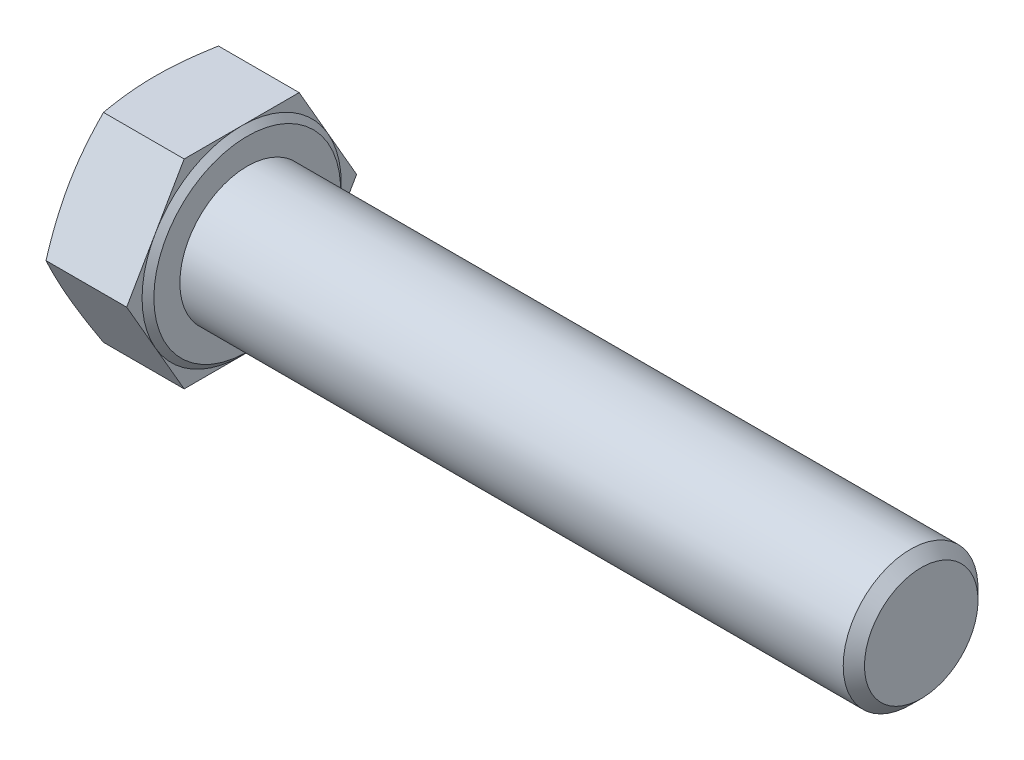
ISO-10303-21;
HEADER;
FILE_DESCRIPTION(('STEP AP214'),'2;1');
FILE_NAME('part.step','',(''),(''),'','','');
FILE_SCHEMA(('AUTOMOTIVE_DESIGN { 1 0 10303 214 1 1 1 1 }'));
ENDSEC;
DATA;
#1=APPLICATION_CONTEXT('core data for automotive mechanical design processes');
#2=APPLICATION_PROTOCOL_DEFINITION('international standard','automotive_design',2000,#1);
#3=PRODUCT_CONTEXT('',#1,'mechanical');
#4=PRODUCT('Part','Part','',(#3));
#5=PRODUCT_RELATED_PRODUCT_CATEGORY('part','',(#4));
#6=PRODUCT_DEFINITION_FORMATION('','',#4);
#7=PRODUCT_DEFINITION_CONTEXT('part definition',#1,'design');
#8=PRODUCT_DEFINITION('design','',#6,#7);
#9=PRODUCT_DEFINITION_SHAPE('','',#8);
#10=(LENGTH_UNIT() NAMED_UNIT(*) SI_UNIT(.MILLI.,.METRE.));
#11=(NAMED_UNIT(*) PLANE_ANGLE_UNIT() SI_UNIT($,.RADIAN.));
#12=(NAMED_UNIT(*) SI_UNIT($,.STERADIAN.) SOLID_ANGLE_UNIT());
#13=UNCERTAINTY_MEASURE_WITH_UNIT(LENGTH_MEASURE(1.E-05),#10,'distance_accuracy_value','');
#14=(GEOMETRIC_REPRESENTATION_CONTEXT(3) GLOBAL_UNCERTAINTY_ASSIGNED_CONTEXT((#13)) GLOBAL_UNIT_ASSIGNED_CONTEXT((#10,
#11,#12)) REPRESENTATION_CONTEXT('',''));
#15=CARTESIAN_POINT('',(0.,0.,0.));
#16=DIRECTION('',(0.,0.,1.));
#17=DIRECTION('',(1.,0.,0.));
#18=AXIS2_PLACEMENT_3D('',#15,#16,#17);
#19=CARTESIAN_POINT('',(8.18,0.,0.));
#20=DIRECTION('',(1.,0.,0.));
#21=DIRECTION('',(0.,0.,-1.));
#22=AXIS2_PLACEMENT_3D('',#19,#20,#21);
#23=PLANE('',#22);
#24=CARTESIAN_POINT('',(8.18,0.,0.));
#25=DIRECTION('',(-1.,0.,0.));
#26=DIRECTION('',(0.,0.,1.));
#27=AXIS2_PLACEMENT_3D('',#24,#25,#26);
#28=CIRCLE('',#27,8.315);
#29=CARTESIAN_POINT('',(8.18000000000001,0.,8.315));
#30=VERTEX_POINT('',#29);
#31=EDGE_CURVE('E147',#30,#30,#28,.T.);
#32=ORIENTED_EDGE('',*,*,#31,.F.);
#33=EDGE_LOOP('',(#32));
#34=FACE_BOUND('',#33,.T.);
#35=CARTESIAN_POINT('',(8.18,0.,0.));
#36=DIRECTION('',(1.,0.,0.));
#37=DIRECTION('',(0.,0.,-1.));
#38=AXIS2_PLACEMENT_3D('',#35,#36,#37);
#39=CIRCLE('',#38,6.);
#40=CARTESIAN_POINT('',(8.18,0.,-6.));
#41=VERTEX_POINT('',#40);
#42=EDGE_CURVE('E149',#41,#41,#39,.T.);
#43=ORIENTED_EDGE('',*,*,#42,.F.);
#44=EDGE_LOOP('',(#43));
#45=FACE_BOUND('',#44,.T.);
#46=ADVANCED_FACE('F43',(#34,#45),#23,.T.);
#47=CARTESIAN_POINT('',(7.68,-17.73,0.));
#48=DIRECTION('',(-1.,0.,0.));
#49=DIRECTION('',(0.,0.,1.));
#50=AXIS2_PLACEMENT_3D('',#47,#48,#49);
#51=PLANE('',#50);
#52=DIRECTION('',(0.,-0.866025403784438,0.5));
#53=VECTOR('',#52,1.);
#54=CARTESIAN_POINT('',(7.68,8.865,5.11821013636603));
#55=LINE('',#54,#53);
#56=CARTESIAN_POINT('',(7.68,8.865,5.11821013636603));
#57=VERTEX_POINT('',#56);
#58=CARTESIAN_POINT('',(7.68,4.4325,7.67731520454905));
#59=VERTEX_POINT('',#58);
#60=EDGE_CURVE('E143',#57,#59,#55,.T.);
#61=ORIENTED_EDGE('',*,*,#60,.T.);
#62=CARTESIAN_POINT('',(7.68,0.,0.));
#63=DIRECTION('',(-1.,0.,0.));
#64=DIRECTION('',(0.,0.,1.));
#65=AXIS2_PLACEMENT_3D('',#62,#63,#64);
#66=CIRCLE('',#65,8.865);
#67=CARTESIAN_POINT('',(7.68,8.865,0.));
#68=VERTEX_POINT('',#67);
#69=EDGE_CURVE('E59',#59,#68,#66,.T.);
#70=ORIENTED_EDGE('',*,*,#69,.T.);
#71=DIRECTION('',(0.,0.,1.));
#72=VECTOR('',#71,1.);
#73=CARTESIAN_POINT('',(7.68,8.865,-5.11821013636603));
#74=LINE('',#73,#72);
#75=EDGE_CURVE('E145',#68,#57,#74,.T.);
#76=ORIENTED_EDGE('',*,*,#75,.T.);
#77=EDGE_LOOP('',(#61,#70,#76));
#78=FACE_BOUND('',#77,.T.);
#79=ADVANCED_FACE('F142',(#78),#51,.F.);
#80=CARTESIAN_POINT('',(7.68,8.865,-5.11821013636603));
#81=VERTEX_POINT('',#80);
#82=EDGE_CURVE('E155',#81,#68,#74,.T.);
#83=ORIENTED_EDGE('',*,*,#82,.T.);
#84=CARTESIAN_POINT('',(7.68,4.4325,-7.67731520454904));
#85=VERTEX_POINT('',#84);
#86=EDGE_CURVE('E128',#68,#85,#66,.T.);
#87=ORIENTED_EDGE('',*,*,#86,.T.);
#88=DIRECTION('',(0.,0.866025403784438,0.5));
#89=VECTOR('',#88,1.);
#90=CARTESIAN_POINT('',(7.68,0.,-10.2364202727321));
#91=LINE('',#90,#89);
#92=EDGE_CURVE('E159',#85,#81,#91,.T.);
#93=ORIENTED_EDGE('',*,*,#92,.T.);
#94=EDGE_LOOP('',(#83,#87,#93));
#95=FACE_BOUND('',#94,.T.);
#96=ADVANCED_FACE('F157',(#95),#51,.F.);
#97=CARTESIAN_POINT('',(7.68,0.,-10.2364202727321));
#98=VERTEX_POINT('',#97);
#99=EDGE_CURVE('E160',#98,#85,#91,.T.);
#100=ORIENTED_EDGE('',*,*,#99,.T.);
#101=CARTESIAN_POINT('',(7.68,-4.4325,-7.67731520454904));
#102=VERTEX_POINT('',#101);
#103=EDGE_CURVE('E132',#85,#102,#66,.T.);
#104=ORIENTED_EDGE('',*,*,#103,.T.);
#105=DIRECTION('',(0.,0.866025403784439,-0.5));
#106=VECTOR('',#105,1.);
#107=CARTESIAN_POINT('',(7.68,-8.865,-5.11821013636604));
#108=LINE('',#107,#106);
#109=EDGE_CURVE('E310',#102,#98,#108,.T.);
#110=ORIENTED_EDGE('',*,*,#109,.T.);
#111=EDGE_LOOP('',(#100,#104,#110));
#112=FACE_BOUND('',#111,.T.);
#113=ADVANCED_FACE('F412',(#112),#51,.F.);
#114=CARTESIAN_POINT('',(7.68,-8.865,-5.11821013636604));
#115=VERTEX_POINT('',#114);
#116=EDGE_CURVE('E304',#115,#102,#108,.T.);
#117=ORIENTED_EDGE('',*,*,#116,.T.);
#118=CARTESIAN_POINT('',(7.68,-8.865,0.));
#119=VERTEX_POINT('',#118);
#120=EDGE_CURVE('E375',#102,#119,#66,.T.);
#121=ORIENTED_EDGE('',*,*,#120,.T.);
#122=DIRECTION('',(0.,0.,-1.));
#123=VECTOR('',#122,1.);
#124=CARTESIAN_POINT('',(7.68,-8.86499999999999,5.11821013636603));
#125=LINE('',#124,#123);
#126=EDGE_CURVE('E171',#119,#115,#125,.T.);
#127=ORIENTED_EDGE('',*,*,#126,.T.);
#128=EDGE_LOOP('',(#117,#121,#127));
#129=FACE_BOUND('',#128,.T.);
#130=ADVANCED_FACE('F287',(#129),#51,.F.);
#131=CARTESIAN_POINT('',(7.68,-8.86499999999999,5.11821013636603));
#132=VERTEX_POINT('',#131);
#133=EDGE_CURVE('E175',#132,#119,#125,.T.);
#134=ORIENTED_EDGE('',*,*,#133,.T.);
#135=CARTESIAN_POINT('',(7.68,-4.4325,7.67731520454904));
#136=VERTEX_POINT('',#135);
#137=EDGE_CURVE('E371',#119,#136,#66,.T.);
#138=ORIENTED_EDGE('',*,*,#137,.T.);
#139=DIRECTION('',(0.,-0.866025403784438,-0.5));
#140=VECTOR('',#139,1.);
#141=CARTESIAN_POINT('',(7.68,0.,10.2364202727321));
#142=LINE('',#141,#140);
#143=EDGE_CURVE('E170',#136,#132,#142,.T.);
#144=ORIENTED_EDGE('',*,*,#143,.T.);
#145=EDGE_LOOP('',(#134,#138,#144));
#146=FACE_BOUND('',#145,.T.);
#147=ADVANCED_FACE('F285',(#146),#51,.F.);
#148=CARTESIAN_POINT('',(7.68,-8.865,-5.11821013636604));
#149=DIRECTION('',(0.,0.5,0.866025403784439));
#150=DIRECTION('',(0.,-0.866025403784439,0.5));
#151=AXIS2_PLACEMENT_3D('',#148,#149,#150);
#152=PLANE('',#151);
#153=CARTESIAN_POINT('',(0.499198186317368,0.000200000000000728,-10.2365357427859));
#154=CARTESIAN_POINT('',(0.422020948629583,-0.36693563222742,-10.0245698866903));
#155=CARTESIAN_POINT('',(0.35181495979472,-0.735281900778896,-9.81190506938712));
#156=CARTESIAN_POINT('',(0.228298465267817,-1.47436940774642,-9.38519269828473));
#157=CARTESIAN_POINT('',(0.175001179779169,-1.84511229003146,-9.17114419539732));
#158=CARTESIAN_POINT('',(0.0887943764437549,-2.58487872785948,-8.74403984337987));
#159=CARTESIAN_POINT('',(0.0556968326321132,-2.95388538970692,-8.53099374782948));
#160=CARTESIAN_POINT('',(0.0113037317696149,-3.69276161815006,-8.10440335844002));
#161=CARTESIAN_POINT('',(0.,-4.06263080907503,-7.89085928149454));
#162=CARTESIAN_POINT('',(0.,-4.80236919092497,-7.46377112760358));
#163=CARTESIAN_POINT('',(0.0113037317696146,-5.17223838184994,-7.2502270506581));
#164=CARTESIAN_POINT('',(0.0556968326321126,-5.91111461029307,-6.82363666126864));
#165=CARTESIAN_POINT('',(0.088794376443754,-6.28012127214052,-6.61059056571825));
#166=CARTESIAN_POINT('',(0.175001179779167,-7.01988770996854,-6.18348621370079));
#167=CARTESIAN_POINT('',(0.228298465267815,-7.39063059225357,-5.96943771081339));
#168=CARTESIAN_POINT('',(0.351814959794718,-8.1297180992211,-5.542725339711));
#169=CARTESIAN_POINT('',(0.422020948629581,-8.49806436777258,-5.33006052240781));
#170=CARTESIAN_POINT('',(0.499198186317365,-8.8652,-5.1180946663122));
#171=B_SPLINE_CURVE_WITH_KNOTS('',3,(#153,#154,#155,#156,#157,#158,#159,#160,#161,#162,#163,
#164,#165,#166,#167,#168,#169,#170),.UNSPECIFIED.,.F.,.F.,(4,2,2,2,2,2,2,2,4),(0.,
1.29283198858306,2.58667231109546,3.86827775500503,5.14940238335838,6.43052701171172,
7.71213245562129,9.00597277813369,10.2988047667168),.UNSPECIFIED.);
#172=CARTESIAN_POINT('',(0.499156157943702,0.,-10.2364202727321));
#173=VERTEX_POINT('',#172);
#174=CARTESIAN_POINT('',(0.,-4.4325,-7.67731520454905));
#175=VERTEX_POINT('',#174);
#176=EDGE_CURVE('E295',#173,#175,#171,.T.);
#177=ORIENTED_EDGE('',*,*,#176,.F.);
#178=DIRECTION('',(-1.,0.,0.));
#179=VECTOR('',#178,1.);
#180=CARTESIAN_POINT('',(7.68,0.,-10.2364202727321));
#181=LINE('',#180,#179);
#182=EDGE_CURVE('E190',#98,#173,#181,.T.);
#183=ORIENTED_EDGE('',*,*,#182,.F.);
#184=ORIENTED_EDGE('',*,*,#109,.F.);
#185=ORIENTED_EDGE('',*,*,#116,.F.);
#186=DIRECTION('',(-1.,0.,0.));
#187=VECTOR('',#186,1.);
#188=CARTESIAN_POINT('',(7.68,-8.865,-5.11821013636604));
#189=LINE('',#188,#187);
#190=CARTESIAN_POINT('',(0.499156157943702,-8.865,-5.11821013636606));
#191=VERTEX_POINT('',#190);
#192=EDGE_CURVE('E174',#115,#191,#189,.T.);
#193=ORIENTED_EDGE('',*,*,#192,.T.);
#194=EDGE_CURVE('E249',#175,#191,#171,.T.);
#195=ORIENTED_EDGE('',*,*,#194,.F.);
#196=EDGE_LOOP('',(#177,#183,#184,#185,#193,#195));
#197=FACE_BOUND('',#196,.T.);
#198=ADVANCED_FACE('F276',(#197),#152,.F.);
#199=CARTESIAN_POINT('',(7.68,0.,-10.2364202727321));
#200=DIRECTION('',(0.,-0.5,0.866025403784438));
#201=DIRECTION('',(0.,-0.866025403784438,-0.5));
#202=AXIS2_PLACEMENT_3D('',#199,#200,#201);
#203=PLANE('',#202);
#204=CARTESIAN_POINT('',(0.499198186317366,8.8652,-5.1180946663122));
#205=CARTESIAN_POINT('',(0.422020948629581,8.49806436777258,-5.3300605224078));
#206=CARTESIAN_POINT('',(0.351814959794718,8.1297180992211,-5.54272533971099));
#207=CARTESIAN_POINT('',(0.228298465267815,7.39063059225358,-5.96943771081338));
#208=CARTESIAN_POINT('',(0.175001179779168,7.01988770996854,-6.18348621370079));
#209=CARTESIAN_POINT('',(0.0887943764437539,6.28012127214052,-6.61059056571824));
#210=CARTESIAN_POINT('',(0.0556968326321124,5.91111461029308,-6.82363666126863));
#211=CARTESIAN_POINT('',(0.0113037317696142,5.17223838184994,-7.25022705065809));
#212=CARTESIAN_POINT('',(0.,4.80236919092497,-7.46377112760357));
#213=CARTESIAN_POINT('',(0.,4.06263080907503,-7.89085928149453));
#214=CARTESIAN_POINT('',(0.0113037317696143,3.69276161815006,-8.10440335844002));
#215=CARTESIAN_POINT('',(0.0556968326321128,2.95388538970693,-8.53099374782948));
#216=CARTESIAN_POINT('',(0.0887943764437546,2.58487872785948,-8.74403984337986));
#217=CARTESIAN_POINT('',(0.175001179779169,1.84511229003146,-9.17114419539732));
#218=CARTESIAN_POINT('',(0.228298465267816,1.47436940774642,-9.38519269828473));
#219=CARTESIAN_POINT('',(0.351814959794719,0.7352819007789,-9.81190506938712));
#220=CARTESIAN_POINT('',(0.422020948629583,0.366935632227423,-10.0245698866903));
#221=CARTESIAN_POINT('',(0.499198186317367,-0.000199999999997552,-10.2365357427859));
#222=B_SPLINE_CURVE_WITH_KNOTS('',3,(#204,#205,#206,#207,#208,#209,#210,#211,#212,#213,#214,
#215,#216,#217,#218,#219,#220,#221),.UNSPECIFIED.,.F.,.F.,(4,2,2,2,2,2,2,2,4),(0.,
1.29283198858306,2.58667231109546,3.86827775500504,5.14940238335838,6.43052701171172,
7.7121324556213,9.0059727781337,10.2988047667168),.UNSPECIFIED.);
#223=CARTESIAN_POINT('',(0.499156157943702,8.865,-5.11821013636605));
#224=VERTEX_POINT('',#223);
#225=CARTESIAN_POINT('',(0.,4.43250000000001,-7.67731520454905));
#226=VERTEX_POINT('',#225);
#227=EDGE_CURVE('E267',#224,#226,#222,.T.);
#228=ORIENTED_EDGE('',*,*,#227,.F.);
#229=DIRECTION('',(-1.,0.,0.));
#230=VECTOR('',#229,1.);
#231=CARTESIAN_POINT('',(7.68,8.865,-5.11821013636603));
#232=LINE('',#231,#230);
#233=EDGE_CURVE('E184',#81,#224,#232,.T.);
#234=ORIENTED_EDGE('',*,*,#233,.F.);
#235=ORIENTED_EDGE('',*,*,#92,.F.);
#236=ORIENTED_EDGE('',*,*,#99,.F.);
#237=ORIENTED_EDGE('',*,*,#182,.T.);
#238=EDGE_CURVE('E262',#226,#173,#222,.T.);
#239=ORIENTED_EDGE('',*,*,#238,.F.);
#240=EDGE_LOOP('',(#228,#234,#235,#236,#237,#239));
#241=FACE_BOUND('',#240,.T.);
#242=ADVANCED_FACE('F277',(#241),#203,.F.);
#243=CARTESIAN_POINT('',(7.68,8.865,-5.11821013636603));
#244=DIRECTION('',(0.,-1.,0.));
#245=DIRECTION('',(0.,0.,-1.));
#246=AXIS2_PLACEMENT_3D('',#243,#244,#245);
#247=PLANE('',#246);
#248=CARTESIAN_POINT('',(2.66729255348065,8.865,-13.5512207547041));
#249=CARTESIAN_POINT('',(2.54516242727046,8.865,-13.1501360974885));
#250=CARTESIAN_POINT('',(2.42445740062612,8.865,-12.7486094302842));
#251=CARTESIAN_POINT('',(2.1866859094498,8.865,-11.9444470461218));
#252=CARTESIAN_POINT('',(2.06961973283893,8.865,-11.5418112441344));
#253=CARTESIAN_POINT('',(1.83971956621832,8.865,-10.7345164062597));
#254=CARTESIAN_POINT('',(1.72689387992466,8.865,-10.3298549971077));
#255=CARTESIAN_POINT('',(1.50679557523847,8.865,-9.51902688408163));
#256=CARTESIAN_POINT('',(1.39952285714112,8.865,-9.1128602073753));
#257=CARTESIAN_POINT('',(1.19318564908009,8.865,-8.30376994091278));
#258=CARTESIAN_POINT('',(1.09403626308954,8.865,-7.90086810947011));
#259=CARTESIAN_POINT('',(0.904178872727226,8.865,-7.09305955514384));
#260=CARTESIAN_POINT('',(0.813471010413736,8.865,-6.68815279864105));
#261=CARTESIAN_POINT('',(0.642611436525388,8.865,-5.87624379223082));
#262=CARTESIAN_POINT('',(0.562456124101907,8.865,-5.46924230662527));
#263=CARTESIAN_POINT('',(0.415142353948846,8.865,-4.65287640970548));
#264=CARTESIAN_POINT('',(0.347983460764029,8.865,-4.2435120780337));
#265=CARTESIAN_POINT('',(0.236040561936041,8.865,-3.46851652026447));
#266=CARTESIAN_POINT('',(0.189592138190722,8.865,-3.10312796859197));
#267=CARTESIAN_POINT('',(0.110966022227835,8.865,-2.37080582119673));
#268=CARTESIAN_POINT('',(0.078787914158539,8.865,-2.00387227081148));
#269=CARTESIAN_POINT('',(0.0302520614165495,8.865,-1.26920440250528));
#270=CARTESIAN_POINT('',(0.0138831267657297,8.865,-0.901470835901202));
#271=CARTESIAN_POINT('',(-0.00220562324277814,8.865,-0.165635793246942));
#272=CARTESIAN_POINT('',(-0.00192555617523766,8.865,0.202465680186733));
#273=CARTESIAN_POINT('',(0.0153120818525456,8.865,0.940139288636389));
#274=CARTESIAN_POINT('',(0.0323542256091547,8.865,1.30970941449611));
#275=CARTESIAN_POINT('',(0.0823317332412224,8.865,2.04776414654804));
#276=CARTESIAN_POINT('',(0.115267478949939,8.865,2.41624872644672));
#277=CARTESIAN_POINT('',(0.195491472137274,8.865,3.15195041470907));
#278=CARTESIAN_POINT('',(0.242792047233561,8.865,3.51916615934214));
#279=CARTESIAN_POINT('',(0.349827059488197,8.865,4.25176055697996));
#280=CARTESIAN_POINT('',(0.409561563288774,8.865,4.61713920012762));
#281=CARTESIAN_POINT('',(0.542957701201057,8.865,5.36528645262003));
#282=CARTESIAN_POINT('',(0.617188885624163,8.865,5.74795260487088));
#283=CARTESIAN_POINT('',(0.775205251952164,8.865,6.5113198296878));
#284=CARTESIAN_POINT('',(0.858991154141732,8.865,6.89202075184027));
#285=CARTESIAN_POINT('',(1.03435761755061,8.865,7.65172880283779));
#286=CARTESIAN_POINT('',(1.12594044250832,8.865,8.03073540591095));
#287=CARTESIAN_POINT('',(1.31541098822802,8.865,8.78715202174608));
#288=CARTESIAN_POINT('',(1.41329855786726,8.865,9.164562072546));
#289=CARTESIAN_POINT('',(1.61432901846385,8.865,9.91849411592856));
#290=CARTESIAN_POINT('',(1.71747849711884,8.865,10.2950143455619));
#291=CARTESIAN_POINT('',(1.92797370771769,8.865,11.0468783862241));
#292=CARTESIAN_POINT('',(2.03531945746363,8.865,11.4222221922548));
#293=CARTESIAN_POINT('',(2.25343759550908,8.865,12.1718406708236));
#294=CARTESIAN_POINT('',(2.36420939086955,8.865,12.5461155162519));
#295=CARTESIAN_POINT('',(2.58860690257439,8.865,13.2938096632688));
#296=CARTESIAN_POINT('',(2.70223263757827,8.865,13.6672289592462));
#297=CARTESIAN_POINT('',(3.04411686536255,8.865,14.7781527167149));
#298=CARTESIAN_POINT('',(3.2758154018621,8.865,15.5145983027504));
#299=CARTESIAN_POINT('',(3.74577835440414,8.865,16.9854197173324));
#300=CARTESIAN_POINT('',(3.98404308546743,8.865,17.7197954447055));
#301=CARTESIAN_POINT('',(4.4644742838834,8.865,19.1841817165721));
#302=CARTESIAN_POINT('',(4.70662251644668,8.865,19.9141982512401));
#303=CARTESIAN_POINT('',(5.07253100335923,8.865,21.0082896330438));
#304=CARTESIAN_POINT('',(5.19494320350068,8.865,21.3728165249887));
#305=CARTESIAN_POINT('',(5.44055969540411,8.865,22.1016024109057));
#306=CARTESIAN_POINT('',(5.56376398523532,8.865,22.4658614055283));
#307=CARTESIAN_POINT('',(5.68731140949676,8.865,22.8300040398282));
#308=B_SPLINE_CURVE_WITH_KNOTS('',3,(#248,#249,#250,#251,#252,#253,#254,#255,#256,#257,#258,
#259,#260,#261,#262,#263,#264,#265,#266,#267,#268,#269,#270,#271,#272,#273,#274,#275,#276,#277,
#278,#279,#280,#281,#282,#283,#284,#285,#286,#287,#288,#289,#290,#291,#292,#293,#294,#295,#296,
#297,#298,#299,#300,#301,#302,#303,#304,#305,#306,#307),.UNSPECIFIED.,.F.,.F.,(4,2,2,2,2,2,2,2,
2,2,2,2,2,2,2,2,2,2,2,2,2,2,2,2,2,2,2,2,2,4),(0.,1.25780938386889,2.51571803886563,
3.77597363797724,5.03620660105611,6.28090154248227,7.52561742648663,8.76990746884634,
10.0141558130695,11.118900212473,12.2236124163687,13.3275421135243,14.431464014761,
15.5409844584839,16.6505315590276,17.7610335550485,18.8715415031891,20.0407904681973,
21.2101276356582,22.379805470879,23.5494552797174,24.7206072106293,25.8917641105285,
27.0627194424487,28.233682432256,30.549734011158,32.865896899426,35.1732714886784,
36.3268658475115,37.4804573954766),.UNSPECIFIED.);
#309=CARTESIAN_POINT('',(0.499156157943704,8.86500000000002,5.11821013636602));
#310=VERTEX_POINT('',#309);
#311=CARTESIAN_POINT('',(0.,8.865,0.));
#312=VERTEX_POINT('',#311);
#313=EDGE_CURVE('E311',#310,#312,#308,.F.);
#314=ORIENTED_EDGE('',*,*,#313,.F.);
#315=DIRECTION('',(-1.,0.,0.));
#316=VECTOR('',#315,1.);
#317=CARTESIAN_POINT('',(7.68,8.865,5.11821013636603));
#318=LINE('',#317,#316);
#319=EDGE_CURVE('E158',#57,#310,#318,.T.);
#320=ORIENTED_EDGE('',*,*,#319,.F.);
#321=ORIENTED_EDGE('',*,*,#75,.F.);
#322=ORIENTED_EDGE('',*,*,#82,.F.);
#323=ORIENTED_EDGE('',*,*,#233,.T.);
#324=EDGE_CURVE('E269',#312,#224,#308,.F.);
#325=ORIENTED_EDGE('',*,*,#324,.F.);
#326=EDGE_LOOP('',(#314,#320,#321,#322,#323,#325));
#327=FACE_BOUND('',#326,.T.);
#328=ADVANCED_FACE('F154',(#327),#247,.F.);
#329=CARTESIAN_POINT('',(7.68,8.865,5.11821013636603));
#330=DIRECTION('',(0.,-0.5,-0.866025403784438));
#331=DIRECTION('',(0.,0.866025403784439,-0.5));
#332=AXIS2_PLACEMENT_3D('',#329,#330,#331);
#333=PLANE('',#332);
#334=CARTESIAN_POINT('',(0.499198186317366,-0.000199999999998198,10.2365357427859));
#335=CARTESIAN_POINT('',(0.422020948629581,0.366935632227422,10.0245698866903));
#336=CARTESIAN_POINT('',(0.351814959794718,0.735281900778899,9.81190506938711));
#337=CARTESIAN_POINT('',(0.228298465267814,1.47436940774642,9.38519269828472));
#338=CARTESIAN_POINT('',(0.175001179779166,1.84511229003146,9.17114419539731));
#339=CARTESIAN_POINT('',(0.0887943764437525,2.58487872785948,8.74403984337986));
#340=CARTESIAN_POINT('',(0.0556968326321108,2.95388538970692,8.53099374782947));
#341=CARTESIAN_POINT('',(0.0113037317696126,3.69276161815006,8.10440335844001));
#342=CARTESIAN_POINT('',(0.,4.06263080907503,7.89085928149453));
#343=CARTESIAN_POINT('',(0.,4.80236919092497,7.46377112760357));
#344=CARTESIAN_POINT('',(0.0113037317696122,5.17223838184994,7.25022705065808));
#345=CARTESIAN_POINT('',(0.0556968326321102,5.91111461029308,6.82363666126862));
#346=CARTESIAN_POINT('',(0.0887943764437517,6.28012127214052,6.61059056571824));
#347=CARTESIAN_POINT('',(0.175001179779166,7.01988770996854,6.18348621370078));
#348=CARTESIAN_POINT('',(0.228298465267814,7.39063059225358,5.96943771081338));
#349=CARTESIAN_POINT('',(0.351814959794717,8.1297180992211,5.54272533971099));
#350=CARTESIAN_POINT('',(0.422020948629581,8.49806436777258,5.3300605224078));
#351=CARTESIAN_POINT('',(0.499198186317365,8.8652,5.11809466631219));
#352=B_SPLINE_CURVE_WITH_KNOTS('',3,(#334,#335,#336,#337,#338,#339,#340,#341,#342,#343,#344,
#345,#346,#347,#348,#349,#350,#351),.UNSPECIFIED.,.F.,.F.,(4,2,2,2,2,2,2,2,4),(0.,
1.29283198858306,2.58667231109546,3.86827775500504,5.14940238335838,6.43052701171172,
7.71213245562129,9.00597277813369,10.2988047667168),.UNSPECIFIED.);
#353=CARTESIAN_POINT('',(0.499156157943704,0.,10.2364202727321));
#354=VERTEX_POINT('',#353);
#355=CARTESIAN_POINT('',(0.,4.4325,7.67731520454905));
#356=VERTEX_POINT('',#355);
#357=EDGE_CURVE('E257',#354,#356,#352,.T.);
#358=ORIENTED_EDGE('',*,*,#357,.F.);
#359=DIRECTION('',(-1.,0.,0.));
#360=VECTOR('',#359,1.);
#361=CARTESIAN_POINT('',(7.68,0.,10.2364202727321));
#362=LINE('',#361,#360);
#363=CARTESIAN_POINT('',(7.68,0.,10.2364202727321));
#364=VERTEX_POINT('',#363);
#365=EDGE_CURVE('E181',#364,#354,#362,.T.);
#366=ORIENTED_EDGE('',*,*,#365,.F.);
#367=EDGE_CURVE('E162',#59,#364,#55,.T.);
#368=ORIENTED_EDGE('',*,*,#367,.F.);
#369=ORIENTED_EDGE('',*,*,#60,.F.);
#370=ORIENTED_EDGE('',*,*,#319,.T.);
#371=EDGE_CURVE('E312',#356,#310,#352,.T.);
#372=ORIENTED_EDGE('',*,*,#371,.F.);
#373=EDGE_LOOP('',(#358,#366,#368,#369,#370,#372));
#374=FACE_BOUND('',#373,.T.);
#375=ADVANCED_FACE('F358',(#374),#333,.F.);
#376=CARTESIAN_POINT('',(7.68,0.,10.2364202727321));
#377=DIRECTION('',(0.,0.5,-0.866025403784438));
#378=DIRECTION('',(0.,0.866025403784438,0.5));
#379=AXIS2_PLACEMENT_3D('',#376,#377,#378);
#380=PLANE('',#379);
#381=CARTESIAN_POINT('',(0.499198186317363,-8.86519999999999,5.11809466631219));
#382=CARTESIAN_POINT('',(0.422020948629579,-8.49806436777257,5.33006052240779));
#383=CARTESIAN_POINT('',(0.351814959794716,-8.1297180992211,5.54272533971098));
#384=CARTESIAN_POINT('',(0.228298465267812,-7.39063059225357,5.96943771081337));
#385=CARTESIAN_POINT('',(0.175001179779164,-7.01988770996853,6.18348621370078));
#386=CARTESIAN_POINT('',(0.0887943764437504,-6.28012127214052,6.61059056571824));
#387=CARTESIAN_POINT('',(0.0556968326321092,-5.91111461029307,6.82363666126862));
#388=CARTESIAN_POINT('',(0.0113037317696111,-5.17223838184993,7.25022705065808));
#389=CARTESIAN_POINT('',(0.,-4.80236919092496,7.46377112760356));
#390=CARTESIAN_POINT('',(0.,-4.06263080907502,7.89085928149453));
#391=CARTESIAN_POINT('',(0.0113037317696116,-3.69276161815005,8.10440335844001));
#392=CARTESIAN_POINT('',(0.0556968326321103,-2.95388538970692,8.53099374782947));
#393=CARTESIAN_POINT('',(0.0887943764437519,-2.58487872785947,8.74403984337986));
#394=CARTESIAN_POINT('',(0.175001179779166,-1.84511229003145,9.17114419539731));
#395=CARTESIAN_POINT('',(0.228298465267814,-1.47436940774642,9.38519269828472));
#396=CARTESIAN_POINT('',(0.351814959794718,-0.735281900778892,9.81190506938711));
#397=CARTESIAN_POINT('',(0.422020948629582,-0.366935632227415,10.0245698866903));
#398=CARTESIAN_POINT('',(0.499198186317366,0.000200000000005362,10.2365357427859));
#399=B_SPLINE_CURVE_WITH_KNOTS('',3,(#381,#382,#383,#384,#385,#386,#387,#388,#389,#390,#391,
#392,#393,#394,#395,#396,#397,#398),.UNSPECIFIED.,.F.,.F.,(4,2,2,2,2,2,2,2,4),(0.,
1.29283198858306,2.58667231109546,3.86827775500504,5.14940238335838,6.43052701171172,
7.7121324556213,9.0059727781337,10.2988047667168),.UNSPECIFIED.);
#400=CARTESIAN_POINT('',(0.499156157943704,-8.86499999999999,5.11821013636607));
#401=VERTEX_POINT('',#400);
#402=CARTESIAN_POINT('',(0.,-4.4325,7.67731520454905));
#403=VERTEX_POINT('',#402);
#404=EDGE_CURVE('E245',#401,#403,#399,.T.);
#405=ORIENTED_EDGE('',*,*,#404,.F.);
#406=DIRECTION('',(-1.,0.,0.));
#407=VECTOR('',#406,1.);
#408=CARTESIAN_POINT('',(7.68,-8.86499999999999,5.11821013636603));
#409=LINE('',#408,#407);
#410=EDGE_CURVE('E178',#132,#401,#409,.T.);
#411=ORIENTED_EDGE('',*,*,#410,.F.);
#412=ORIENTED_EDGE('',*,*,#143,.F.);
#413=EDGE_CURVE('E166',#364,#136,#142,.T.);
#414=ORIENTED_EDGE('',*,*,#413,.F.);
#415=ORIENTED_EDGE('',*,*,#365,.T.);
#416=EDGE_CURVE('E299',#403,#354,#399,.T.);
#417=ORIENTED_EDGE('',*,*,#416,.F.);
#418=EDGE_LOOP('',(#405,#411,#412,#414,#415,#417));
#419=FACE_BOUND('',#418,.T.);
#420=ADVANCED_FACE('F355',(#419),#380,.F.);
#421=CARTESIAN_POINT('',(7.68,-8.86499999999999,5.11821013636603));
#422=DIRECTION('',(0.,1.,0.));
#423=DIRECTION('',(0.,0.,1.));
#424=AXIS2_PLACEMENT_3D('',#421,#422,#423);
#425=PLANE('',#424);
#426=CARTESIAN_POINT('',(2.66729303265726,-8.865,-13.5512223279166));
#427=CARTESIAN_POINT('',(2.54516288364966,-8.865,-13.1501376097718));
#428=CARTESIAN_POINT('',(2.42445783426883,-8.865,-12.7486108816037));
#429=CARTESIAN_POINT('',(2.18668629789235,-8.865,-11.9444483753836));
#430=CARTESIAN_POINT('',(2.06962009881786,-8.865,-11.5418125123022));
#431=CARTESIAN_POINT('',(1.83971988757887,-8.865,-10.7345175516725));
#432=CARTESIAN_POINT('',(1.7268941791343,-8.865,-10.3298560808584));
#433=CARTESIAN_POINT('',(1.50679583084334,-8.865,-9.51902784425154));
#434=CARTESIAN_POINT('',(1.39952309129209,-8.865,-9.11286110562663));
#435=CARTESIAN_POINT('',(1.1931858416642,-8.865,-8.30377071573224));
#436=CARTESIAN_POINT('',(1.09403643554735,-8.865,-7.90086882278078));
#437=CARTESIAN_POINT('',(0.904179006535941,-8.865,-7.09306014494414));
#438=CARTESIAN_POINT('',(0.813471125699862,-8.865,-6.68815332643973));
#439=CARTESIAN_POINT('',(0.642611517187804,-8.865,-5.87624419555143));
#440=CARTESIAN_POINT('',(0.56245618865918,-8.865,-5.46924264747034));
#441=CARTESIAN_POINT('',(0.415142389729118,-8.865,-4.65287662488673));
#442=CARTESIAN_POINT('',(0.347983483871567,-8.865,-4.24351223002684));
#443=CARTESIAN_POINT('',(0.236040575865524,-8.865,-3.4685166237835));
#444=CARTESIAN_POINT('',(0.18959215268752,-8.865,-3.10312808725521));
#445=CARTESIAN_POINT('',(0.110966036473816,-8.865,-2.3708059702299));
#446=CARTESIAN_POINT('',(0.078787927586424,-8.865,-2.00387243507035));
#447=CARTESIAN_POINT('',(0.0302520717053725,-8.865,-1.26920459718332));
#448=CARTESIAN_POINT('',(0.0138831347351715,-8.865,-0.90147104577267));
#449=CARTESIAN_POINT('',(-0.00220562137213156,-8.865,-0.165636033382498));
#450=CARTESIAN_POINT('',(-0.00192555808400081,-8.86499999999999,0.202465424980515));
#451=CARTESIAN_POINT('',(0.0153120710988613,-8.86499999999999,0.94013900288251));
#452=CARTESIAN_POINT('',(0.0323542097587355,-8.86499999999999,1.30970911326693));
#453=CARTESIAN_POINT('',(0.0823317062148892,-8.86499999999999,2.04776381463302));
#454=CARTESIAN_POINT('',(0.115267445844286,-8.86499999999999,2.41624837932119));
#455=CARTESIAN_POINT('',(0.195491426235195,-8.86499999999999,3.15195003735931));
#456=CARTESIAN_POINT('',(0.242791994611966,-8.86499999999999,3.5191657669791));
#457=CARTESIAN_POINT('',(0.349826993098682,-8.86499999999999,4.25176013480009));
#458=CARTESIAN_POINT('',(0.409561489850844,-8.86499999999999,4.61713876314422));
#459=CARTESIAN_POINT('',(0.542957615924491,-8.86499999999999,5.36528600080223));
#460=CARTESIAN_POINT('',(0.617188796018038,-8.86499999999999,5.74795215294647));
#461=CARTESIAN_POINT('',(0.775205154407065,-8.86499999999999,6.51131937750143));
#462=CARTESIAN_POINT('',(0.858991052987387,-8.86499999999999,6.89202029949853));
#463=CARTESIAN_POINT('',(1.03435750978799,-8.86499999999999,7.65172835013048));
#464=CARTESIAN_POINT('',(1.12594033174725,-8.86499999999999,8.03073495299332));
#465=CARTESIAN_POINT('',(1.3154108719662,-8.86499999999999,8.78715156832586));
#466=CARTESIAN_POINT('',(1.41329843910312,-8.86499999999999,9.16456161883351));
#467=CARTESIAN_POINT('',(1.61432889513262,-8.86499999999999,9.91849366171031));
#468=CARTESIAN_POINT('',(1.71747837172549,-8.86499999999999,10.2950138911295));
#469=CARTESIAN_POINT('',(1.9279735785224,-8.86499999999999,11.0468779312932));
#470=CARTESIAN_POINT('',(2.03531932652853,-8.86499999999999,11.4222217370396));
#471=CARTESIAN_POINT('',(2.25343746134827,-8.86499999999999,12.1718402149689));
#472=CARTESIAN_POINT('',(2.36420925522272,-8.86499999999999,12.5461150600421));
#473=CARTESIAN_POINT('',(2.58860676416071,-8.86499999999999,13.293809206297));
#474=CARTESIAN_POINT('',(2.70223249788377,-8.86499999999999,13.6672285018674));
#475=CARTESIAN_POINT('',(3.04411672358947,-8.86499999999999,14.7781522629113));
#476=CARTESIAN_POINT('',(3.27581525958919,-8.86499999999999,15.5145978528469));
#477=CARTESIAN_POINT('',(3.74577821162164,-8.86499999999999,16.9854192750901));
#478=CARTESIAN_POINT('',(3.98404294267524,-8.86499999999999,17.7197950062241));
#479=CARTESIAN_POINT('',(4.46447414120277,-8.86499999999999,19.1841812848998));
#480=CARTESIAN_POINT('',(4.70662237388216,-8.86499999999999,19.9141978226176));
#481=CARTESIAN_POINT('',(5.07253086113144,-8.86499999999999,21.0082892089391));
#482=CARTESIAN_POINT('',(5.19494306141148,-8.86499999999999,21.3728161023783));
#483=CARTESIAN_POINT('',(5.44055955363848,-8.86499999999999,22.1016019912687));
#484=CARTESIAN_POINT('',(5.56376384365469,-8.86499999999999,22.4658609873705));
#485=CARTESIAN_POINT('',(5.68731126812025,-8.86499999999999,22.8300036231434));
#486=B_SPLINE_CURVE_WITH_KNOTS('',3,(#426,#427,#428,#429,#430,#431,#432,#433,#434,#435,#436,
#437,#438,#439,#440,#441,#442,#443,#444,#445,#446,#447,#448,#449,#450,#451,#452,#453,#454,#455,
#456,#457,#458,#459,#460,#461,#462,#463,#464,#465,#466,#467,#468,#469,#470,#471,#472,#473,#474,
#475,#476,#477,#478,#479,#480,#481,#482,#483,#484,#485),.UNSPECIFIED.,.F.,.F.,(4,2,2,2,2,2,2,2,
2,2,2,2,2,2,2,2,2,2,2,2,2,2,2,2,2,2,2,2,2,4),(0.,1.25780957865336,2.51571842845871,
3.77597422360547,5.03620738271056,6.28090251773189,7.52561859535927,8.76990883089671,
10.0141573682183,11.1189017223789,12.2236138810328,13.3275435330149,14.4314653890781,
15.5409857857567,16.6505328392468,17.7610347880286,18.871542688929,20.0407916511264,
21.2101288157901,22.3798066482743,23.5494564543725,24.7206083830256,25.8917652806667,
27.0627206102981,28.2336835978177,30.5497351874231,32.8658980864118,35.1732726844563,
36.3268670476711,37.4804586000175),.UNSPECIFIED.);
#487=CARTESIAN_POINT('',(0.,-8.86499999999999,0.));
#488=VERTEX_POINT('',#487);
#489=EDGE_CURVE('E322',#191,#488,#486,.T.);
#490=ORIENTED_EDGE('',*,*,#489,.F.);
#491=ORIENTED_EDGE('',*,*,#192,.F.);
#492=ORIENTED_EDGE('',*,*,#126,.F.);
#493=ORIENTED_EDGE('',*,*,#133,.F.);
#494=ORIENTED_EDGE('',*,*,#410,.T.);
#495=EDGE_CURVE('E233',#488,#401,#486,.T.);
#496=ORIENTED_EDGE('',*,*,#495,.F.);
#497=EDGE_LOOP('',(#490,#491,#492,#493,#494,#496));
#498=FACE_BOUND('',#497,.T.);
#499=ADVANCED_FACE('F350',(#498),#425,.F.);
#500=ORIENTED_EDGE('',*,*,#413,.T.);
#501=EDGE_CURVE('E150',#136,#59,#66,.T.);
#502=ORIENTED_EDGE('',*,*,#501,.T.);
#503=ORIENTED_EDGE('',*,*,#367,.T.);
#504=EDGE_LOOP('',(#500,#502,#503));
#505=FACE_BOUND('',#504,.T.);
#506=ADVANCED_FACE('F213',(#505),#51,.F.);
#507=CARTESIAN_POINT('',(0.,0.,0.));
#508=DIRECTION('',(1.,0.,0.));
#509=DIRECTION('',(0.,0.,-1.));
#510=AXIS2_PLACEMENT_3D('',#507,#508,#509);
#511=CONICAL_SURFACE('',#510,8.865,1.22173047639604);
#512=ORIENTED_EDGE('',*,*,#357,.T.);
#513=CARTESIAN_POINT('',(0.,0.,0.));
#514=DIRECTION('',(-1.,0.,0.));
#515=DIRECTION('',(0.,0.,1.));
#516=AXIS2_PLACEMENT_3D('',#513,#514,#515);
#517=CIRCLE('',#516,8.865);
#518=EDGE_CURVE('E188',#403,#356,#517,.T.);
#519=ORIENTED_EDGE('',*,*,#518,.F.);
#520=ORIENTED_EDGE('',*,*,#416,.T.);
#521=EDGE_LOOP('',(#512,#519,#520));
#522=FACE_BOUND('',#521,.T.);
#523=ADVANCED_FACE('F378',(#522),#511,.T.);
#524=ORIENTED_EDGE('',*,*,#404,.T.);
#525=EDGE_CURVE('E194',#488,#403,#517,.T.);
#526=ORIENTED_EDGE('',*,*,#525,.F.);
#527=ORIENTED_EDGE('',*,*,#495,.T.);
#528=EDGE_LOOP('',(#524,#526,#527));
#529=FACE_BOUND('',#528,.T.);
#530=ADVANCED_FACE('F228',(#529),#511,.T.);
#531=ORIENTED_EDGE('',*,*,#194,.T.);
#532=ORIENTED_EDGE('',*,*,#489,.T.);
#533=EDGE_CURVE('E374',#175,#488,#517,.T.);
#534=ORIENTED_EDGE('',*,*,#533,.F.);
#535=EDGE_LOOP('',(#531,#532,#534));
#536=FACE_BOUND('',#535,.T.);
#537=ADVANCED_FACE('F377',(#536),#511,.T.);
#538=ORIENTED_EDGE('',*,*,#238,.T.);
#539=ORIENTED_EDGE('',*,*,#176,.T.);
#540=EDGE_CURVE('E373',#226,#175,#517,.T.);
#541=ORIENTED_EDGE('',*,*,#540,.F.);
#542=EDGE_LOOP('',(#538,#539,#541));
#543=FACE_BOUND('',#542,.T.);
#544=ADVANCED_FACE('F381',(#543),#511,.T.);
#545=ORIENTED_EDGE('',*,*,#324,.T.);
#546=ORIENTED_EDGE('',*,*,#227,.T.);
#547=EDGE_CURVE('E195',#312,#226,#517,.T.);
#548=ORIENTED_EDGE('',*,*,#547,.F.);
#549=EDGE_LOOP('',(#545,#546,#548));
#550=FACE_BOUND('',#549,.T.);
#551=ADVANCED_FACE('F224',(#550),#511,.T.);
#552=ORIENTED_EDGE('',*,*,#313,.T.);
#553=CARTESIAN_POINT('',(0.,0.,0.));
#554=DIRECTION('',(-1.,0.,0.));
#555=DIRECTION('',(0.,0.,1.));
#556=AXIS2_PLACEMENT_3D('',#553,#554,#555);
#557=CIRCLE('',#556,8.865);
#558=EDGE_CURVE('E68',#356,#312,#557,.T.);
#559=ORIENTED_EDGE('',*,*,#558,.F.);
#560=ORIENTED_EDGE('',*,*,#371,.T.);
#561=EDGE_LOOP('',(#552,#559,#560));
#562=FACE_BOUND('',#561,.T.);
#563=ADVANCED_FACE('F223',(#562),#511,.T.);
#564=CARTESIAN_POINT('',(0.,-17.73,0.));
#565=DIRECTION('',(-1.,0.,0.));
#566=DIRECTION('',(0.,0.,1.));
#567=AXIS2_PLACEMENT_3D('',#564,#565,#566);
#568=PLANE('',#567);
#569=ORIENTED_EDGE('',*,*,#518,.T.);
#570=ORIENTED_EDGE('',*,*,#558,.T.);
#571=ORIENTED_EDGE('',*,*,#547,.T.);
#572=ORIENTED_EDGE('',*,*,#540,.T.);
#573=ORIENTED_EDGE('',*,*,#533,.T.);
#574=ORIENTED_EDGE('',*,*,#525,.T.);
#575=EDGE_LOOP('',(#569,#570,#571,#572,#573,#574));
#576=FACE_BOUND('',#575,.T.);
#577=ADVANCED_FACE('F222',(#576),#568,.T.);
#578=CARTESIAN_POINT('',(7.68,0.,0.));
#579=DIRECTION('',(-1.,0.,0.));
#580=DIRECTION('',(0.,0.,1.));
#581=AXIS2_PLACEMENT_3D('',#578,#579,#580);
#582=CONICAL_SURFACE('',#581,8.865,0.832981266674424);
#583=ORIENTED_EDGE('',*,*,#31,.T.);
#584=EDGE_LOOP('',(#583));
#585=FACE_BOUND('',#584,.T.);
#586=ORIENTED_EDGE('',*,*,#69,.F.);
#587=ORIENTED_EDGE('',*,*,#501,.F.);
#588=ORIENTED_EDGE('',*,*,#137,.F.);
#589=ORIENTED_EDGE('',*,*,#120,.F.);
#590=ORIENTED_EDGE('',*,*,#103,.F.);
#591=ORIENTED_EDGE('',*,*,#86,.F.);
#592=EDGE_LOOP('',(#586,#587,#588,#589,#590,#591));
#593=FACE_BOUND('',#592,.T.);
#594=ADVANCED_FACE('F133',(#585,#593),#582,.T.);
#595=CARTESIAN_POINT('',(68.18,0.,0.));
#596=DIRECTION('',(-1.,0.,0.));
#597=DIRECTION('',(0.,0.,1.));
#598=AXIS2_PLACEMENT_3D('',#595,#596,#597);
#599=CYLINDRICAL_SURFACE('',#598,6.);
#600=CARTESIAN_POINT('',(67.233,0.,0.));
#601=DIRECTION('',(1.,0.,0.));
#602=DIRECTION('',(0.,0.,-1.));
#603=AXIS2_PLACEMENT_3D('',#600,#601,#602);
#604=CIRCLE('',#603,6.);
#605=CARTESIAN_POINT('',(67.2330000000001,0.,5.99999999999999));
#606=VERTEX_POINT('',#605);
#607=EDGE_CURVE('E11',#606,#606,#604,.F.);
#608=ORIENTED_EDGE('',*,*,#607,.T.);
#609=EDGE_LOOP('',(#608));
#610=FACE_BOUND('',#609,.T.);
#611=ORIENTED_EDGE('',*,*,#42,.T.);
#612=EDGE_LOOP('',(#611));
#613=FACE_BOUND('',#612,.T.);
#614=ADVANCED_FACE('F202',(#610,#613),#599,.T.);
#615=CARTESIAN_POINT('',(68.18,0.,0.));
#616=DIRECTION('',(1.,0.,0.));
#617=DIRECTION('',(0.,0.,-1.));
#618=AXIS2_PLACEMENT_3D('',#615,#616,#617);
#619=PLANE('',#618);
#620=CARTESIAN_POINT('',(68.18,0.,0.));
#621=DIRECTION('',(1.,0.,0.));
#622=DIRECTION('',(0.,0.,-1.));
#623=AXIS2_PLACEMENT_3D('',#620,#621,#622);
#624=CIRCLE('',#623,5.05300000000002);
#625=CARTESIAN_POINT('',(68.18,0.,5.05300000000001));
#626=VERTEX_POINT('',#625);
#627=EDGE_CURVE('E51',#626,#626,#624,.T.);
#628=ORIENTED_EDGE('',*,*,#627,.T.);
#629=EDGE_LOOP('',(#628));
#630=FACE_BOUND('',#629,.T.);
#631=ADVANCED_FACE('F199',(#630),#619,.T.);
#632=CARTESIAN_POINT('',(68.18,0.,0.));
#633=DIRECTION('',(-1.,0.,0.));
#634=DIRECTION('',(0.,0.,1.));
#635=AXIS2_PLACEMENT_3D('',#632,#633,#634);
#636=CONICAL_SURFACE('',#635,5.05300000000002,0.785398163397457);
#637=CARTESIAN_POINT('',(67.2330000000001,0.,5.99999999999999));
#638=CARTESIAN_POINT('',(67.2428645833334,0.,5.99013541666665));
#639=CARTESIAN_POINT('',(67.2527291666667,0.,5.98027083333332));
#640=CARTESIAN_POINT('',(67.2724583333334,0.,5.96054166666665));
#641=CARTESIAN_POINT('',(67.2823229166667,0.,5.95067708333332));
#642=CARTESIAN_POINT('',(67.3020520833334,0.,5.93094791666665));
#643=CARTESIAN_POINT('',(67.3119166666667,0.,5.92108333333332));
#644=CARTESIAN_POINT('',(67.3316458333334,0.,5.90135416666665));
#645=CARTESIAN_POINT('',(67.3415104166667,0.,5.89148958333332));
#646=CARTESIAN_POINT('',(67.3612395833334,0.,5.87176041666665));
#647=CARTESIAN_POINT('',(67.3711041666667,0.,5.86189583333332));
#648=CARTESIAN_POINT('',(67.3908333333334,0.,5.84216666666665));
#649=CARTESIAN_POINT('',(67.4006979166667,0.,5.83230208333332));
#650=CARTESIAN_POINT('',(67.4204270833334,0.,5.81257291666666));
#651=CARTESIAN_POINT('',(67.4302916666667,0.,5.80270833333332));
#652=CARTESIAN_POINT('',(67.4500208333334,0.,5.78297916666665));
#653=CARTESIAN_POINT('',(67.4598854166667,0.,5.77311458333332));
#654=CARTESIAN_POINT('',(67.4796145833334,0.,5.75338541666666));
#655=CARTESIAN_POINT('',(67.4894791666667,0.,5.74352083333332));
#656=CARTESIAN_POINT('',(67.5092083333334,0.,5.72379166666666));
#657=CARTESIAN_POINT('',(67.5190729166667,0.,5.71392708333333));
#658=CARTESIAN_POINT('',(67.5388020833334,0.,5.69419791666666));
#659=CARTESIAN_POINT('',(67.5486666666667,0.,5.68433333333333));
#660=CARTESIAN_POINT('',(67.5683958333334,0.,5.66460416666666));
#661=CARTESIAN_POINT('',(67.5782604166667,0.,5.65473958333333));
#662=CARTESIAN_POINT('',(67.5979895833334,0.,5.63501041666666));
#663=CARTESIAN_POINT('',(67.6078541666667,0.,5.62514583333333));
#664=CARTESIAN_POINT('',(67.6275833333334,0.,5.60541666666666));
#665=CARTESIAN_POINT('',(67.6374479166667,0.,5.59555208333333));
#666=CARTESIAN_POINT('',(67.6571770833334,0.,5.57582291666666));
#667=CARTESIAN_POINT('',(67.6670416666667,0.,5.56595833333333));
#668=CARTESIAN_POINT('',(67.6867708333334,0.,5.54622916666666));
#669=CARTESIAN_POINT('',(67.6966354166667,0.,5.53636458333333));
#670=CARTESIAN_POINT('',(67.7163645833334,0.,5.51663541666666));
#671=CARTESIAN_POINT('',(67.7262291666667,0.,5.50677083333333));
#672=CARTESIAN_POINT('',(67.7459583333334,0.,5.48704166666666));
#673=CARTESIAN_POINT('',(67.7558229166667,0.,5.47717708333333));
#674=CARTESIAN_POINT('',(67.7755520833334,0.,5.45744791666666));
#675=CARTESIAN_POINT('',(67.7854166666667,0.,5.44758333333333));
#676=CARTESIAN_POINT('',(67.8051458333334,0.,5.42785416666667));
#677=CARTESIAN_POINT('',(67.8150104166667,0.,5.41798958333333));
#678=CARTESIAN_POINT('',(67.8347395833334,0.,5.39826041666666));
#679=CARTESIAN_POINT('',(67.8446041666667,0.,5.38839583333333));
#680=CARTESIAN_POINT('',(67.8643333333334,0.,5.36866666666667));
#681=CARTESIAN_POINT('',(67.8741979166667,0.,5.35880208333333));
#682=CARTESIAN_POINT('',(67.8939270833334,0.,5.33907291666667));
#683=CARTESIAN_POINT('',(67.9037916666667,0.,5.32920833333333));
#684=CARTESIAN_POINT('',(67.9235208333334,0.,5.30947916666667));
#685=CARTESIAN_POINT('',(67.9333854166667,0.,5.29961458333333));
#686=CARTESIAN_POINT('',(67.9531145833334,0.,5.27988541666667));
#687=CARTESIAN_POINT('',(67.9629791666667,0.,5.27002083333334));
#688=CARTESIAN_POINT('',(67.9827083333333,0.,5.25029166666667));
#689=CARTESIAN_POINT('',(67.9925729166667,0.,5.24042708333333));
#690=CARTESIAN_POINT('',(68.0123020833334,0.,5.22069791666667));
#691=CARTESIAN_POINT('',(68.0221666666667,0.,5.21083333333334));
#692=CARTESIAN_POINT('',(68.0418958333334,0.,5.19110416666667));
#693=CARTESIAN_POINT('',(68.0517604166667,0.,5.18123958333334));
#694=CARTESIAN_POINT('',(68.0714895833333,0.,5.16151041666667));
#695=CARTESIAN_POINT('',(68.0813541666667,0.,5.15164583333334));
#696=CARTESIAN_POINT('',(68.1010833333333,0.,5.13191666666667));
#697=CARTESIAN_POINT('',(68.1109479166667,0.,5.12205208333334));
#698=CARTESIAN_POINT('',(68.1306770833334,0.,5.10232291666667));
#699=CARTESIAN_POINT('',(68.1405416666667,0.,5.09245833333334));
#700=CARTESIAN_POINT('',(68.1602708333333,0.,5.07272916666667));
#701=CARTESIAN_POINT('',(68.1701354166667,0.,5.06286458333334));
#702=CARTESIAN_POINT('',(68.18,0.,5.05300000000001));
#703=B_SPLINE_CURVE_WITH_KNOTS('',3,(#637,#638,#639,#640,#641,#642,#643,#644,#645,#646,#647,
#648,#649,#650,#651,#652,#653,#654,#655,#656,#657,#658,#659,#660,#661,#662,#663,#664,#665,#666,
#667,#668,#669,#670,#671,#672,#673,#674,#675,#676,#677,#678,#679,#680,#681,#682,#683,#684,#685,
#686,#687,#688,#689,#690,#691,#692,#693,#694,#695,#696,#697,#698,#699,#700,#701,#702),
.UNSPECIFIED.,.F.,.F.,(4,2,2,2,2,2,2,2,2,2,2,2,2,2,2,2,2,2,2,2,2,2,2,2,2,2,2,2,2,2,2,2,4),(0.,
0.0418518826114691,0.083703765222948,0.125555647834428,0.167407530445907,0.209259413057385,
0.251111295668864,0.292963178280334,0.334815060891812,0.376666943503291,0.41851882611477,
0.460370708726249,0.502222591337729,0.544074473949198,0.585926356560677,0.627778239172156,
0.669630121783635,0.711482004395114,0.753333887006592,0.795185769618071,0.837037652229541,
0.87888953484102,0.920741417452499,0.962593300063978,1.00444518267546,1.04629706528694,
1.0881489478984,1.13000083050988,1.17185271312136,1.21370459573284,1.25555647834432,
1.2974083609558,1.33926024356727),.UNSPECIFIED.);
#704=EDGE_CURVE('BSEAM44',#606,#626,#703,.T.);
#705=ORIENTED_EDGE('',*,*,#607,.F.);
#706=ORIENTED_EDGE('',*,*,#627,.F.);
#707=ORIENTED_EDGE('',*,*,#704,.T.);
#708=ORIENTED_EDGE('',*,*,#704,.F.);
#709=EDGE_LOOP('',(#705,#707,#706,#708));
#710=FACE_BOUND('',#709,.T.);
#711=ADVANCED_FACE('F44',(#710),#636,.T.);
#712=CLOSED_SHELL('',(#46,#79,#96,#113,#130,#147,#198,#242,#328,#375,#420,#499,#506,#523,#530,
#537,#544,#551,#563,#577,#594,#614,#631,#711));
#713=MANIFOLD_SOLID_BREP('B2',#712);
#714=ADVANCED_BREP_SHAPE_REPRESENTATION('',(#18,#713),#14);
#715=SHAPE_DEFINITION_REPRESENTATION(#9,#714);
ENDSEC;
END-ISO-10303-21;
